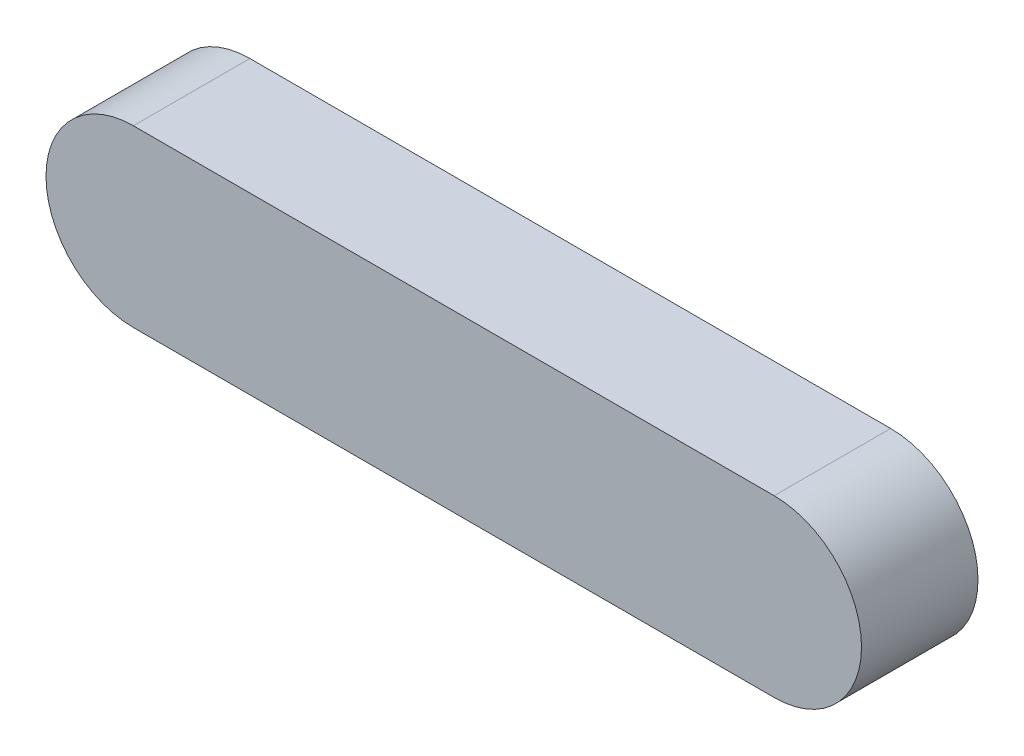
ISO-10303-21;
HEADER;
FILE_DESCRIPTION(('STEP AP214'),'2;1');
FILE_NAME('part.step','',(''),(''),'','','');
FILE_SCHEMA(('AUTOMOTIVE_DESIGN { 1 0 10303 214 1 1 1 1 }'));
ENDSEC;
DATA;
#1=APPLICATION_CONTEXT('core data for automotive mechanical design processes');
#2=APPLICATION_PROTOCOL_DEFINITION('international standard','automotive_design',2000,#1);
#3=PRODUCT_CONTEXT('',#1,'mechanical');
#4=PRODUCT('Part','Part','',(#3));
#5=PRODUCT_RELATED_PRODUCT_CATEGORY('part','',(#4));
#6=PRODUCT_DEFINITION_FORMATION('','',#4);
#7=PRODUCT_DEFINITION_CONTEXT('part definition',#1,'design');
#8=PRODUCT_DEFINITION('design','',#6,#7);
#9=PRODUCT_DEFINITION_SHAPE('','',#8);
#10=(LENGTH_UNIT() NAMED_UNIT(*) SI_UNIT(.MILLI.,.METRE.));
#11=(NAMED_UNIT(*) PLANE_ANGLE_UNIT() SI_UNIT($,.RADIAN.));
#12=(NAMED_UNIT(*) SI_UNIT($,.STERADIAN.) SOLID_ANGLE_UNIT());
#13=UNCERTAINTY_MEASURE_WITH_UNIT(LENGTH_MEASURE(1.E-05),#10,'distance_accuracy_value','');
#14=(GEOMETRIC_REPRESENTATION_CONTEXT(3) GLOBAL_UNCERTAINTY_ASSIGNED_CONTEXT((#13)) GLOBAL_UNIT_ASSIGNED_CONTEXT((#10,
#11,#12)) REPRESENTATION_CONTEXT('',''));
#15=CARTESIAN_POINT('',(0.,0.,0.));
#16=DIRECTION('',(0.,0.,1.));
#17=DIRECTION('',(1.,0.,0.));
#18=AXIS2_PLACEMENT_3D('',#15,#16,#17);
#19=CARTESIAN_POINT('',(-22.,0.,8.00000000000001));
#20=DIRECTION('',(0.,0.,-1.));
#21=DIRECTION('',(-1.,0.,0.));
#22=AXIS2_PLACEMENT_3D('',#19,#20,#21);
#23=CYLINDRICAL_SURFACE('',#22,6.);
#24=CARTESIAN_POINT('',(-22.,0.,0.));
#25=DIRECTION('',(0.,0.,1.));
#26=DIRECTION('',(1.,0.,0.));
#27=AXIS2_PLACEMENT_3D('',#24,#25,#26);
#28=CIRCLE('',#27,6.);
#29=CARTESIAN_POINT('',(-22.,6.00000000000001,0.));
#30=VERTEX_POINT('',#29);
#31=CARTESIAN_POINT('',(-22.,-6.00000000000001,0.));
#32=VERTEX_POINT('',#31);
#33=EDGE_CURVE('E95',#30,#32,#28,.T.);
#34=ORIENTED_EDGE('',*,*,#33,.T.);
#35=DIRECTION('',(0.,0.,-1.));
#36=VECTOR('',#35,1.);
#37=CARTESIAN_POINT('',(-22.,-6.00000000000001,8.00000000000001));
#38=LINE('',#37,#36);
#39=CARTESIAN_POINT('',(-22.,-6.00000000000001,8.00000000000001));
#40=VERTEX_POINT('',#39);
#41=EDGE_CURVE('E11',#40,#32,#38,.T.);
#42=ORIENTED_EDGE('',*,*,#41,.F.);
#43=CARTESIAN_POINT('',(-22.,0.,8.00000000000001));
#44=DIRECTION('',(0.,0.,1.));
#45=DIRECTION('',(1.,0.,0.));
#46=AXIS2_PLACEMENT_3D('',#43,#44,#45);
#47=CIRCLE('',#46,6.);
#48=CARTESIAN_POINT('',(-22.,6.00000000000001,8.00000000000001));
#49=VERTEX_POINT('',#48);
#50=EDGE_CURVE('E83',#49,#40,#47,.T.);
#51=ORIENTED_EDGE('',*,*,#50,.F.);
#52=DIRECTION('',(0.,0.,-1.));
#53=VECTOR('',#52,1.);
#54=CARTESIAN_POINT('',(-22.,6.00000000000001,8.00000000000001));
#55=LINE('',#54,#53);
#56=EDGE_CURVE('E91',#49,#30,#55,.T.);
#57=ORIENTED_EDGE('',*,*,#56,.T.);
#58=EDGE_LOOP('',(#34,#42,#51,#57));
#59=FACE_BOUND('',#58,.T.);
#60=ADVANCED_FACE('F32',(#59),#23,.T.);
#61=CARTESIAN_POINT('',(-22.,-6.00000000000001,8.00000000000001));
#62=DIRECTION('',(0.,1.,0.));
#63=DIRECTION('',(0.,0.,1.));
#64=AXIS2_PLACEMENT_3D('',#61,#62,#63);
#65=PLANE('',#64);
#66=DIRECTION('',(1.,0.,0.));
#67=VECTOR('',#66,1.);
#68=CARTESIAN_POINT('',(-22.,-6.00000000000001,0.));
#69=LINE('',#68,#67);
#70=CARTESIAN_POINT('',(22.,-6.00000000000001,0.));
#71=VERTEX_POINT('',#70);
#72=EDGE_CURVE('E87',#32,#71,#69,.T.);
#73=ORIENTED_EDGE('',*,*,#72,.T.);
#74=DIRECTION('',(0.,0.,-1.));
#75=VECTOR('',#74,1.);
#76=CARTESIAN_POINT('',(22.,-6.00000000000001,8.00000000000001));
#77=LINE('',#76,#75);
#78=CARTESIAN_POINT('',(22.,-6.00000000000001,8.00000000000001));
#79=VERTEX_POINT('',#78);
#80=EDGE_CURVE('E40',#79,#71,#77,.T.);
#81=ORIENTED_EDGE('',*,*,#80,.F.);
#82=DIRECTION('',(1.,0.,0.));
#83=VECTOR('',#82,1.);
#84=CARTESIAN_POINT('',(-22.,-6.00000000000001,8.00000000000001));
#85=LINE('',#84,#83);
#86=EDGE_CURVE('E78',#40,#79,#85,.T.);
#87=ORIENTED_EDGE('',*,*,#86,.F.);
#88=ORIENTED_EDGE('',*,*,#41,.T.);
#89=EDGE_LOOP('',(#73,#81,#87,#88));
#90=FACE_BOUND('',#89,.T.);
#91=ADVANCED_FACE('F86',(#90),#65,.F.);
#92=CARTESIAN_POINT('',(22.,0.,8.00000000000001));
#93=DIRECTION('',(0.,0.,-1.));
#94=DIRECTION('',(-1.,0.,0.));
#95=AXIS2_PLACEMENT_3D('',#92,#93,#94);
#96=CYLINDRICAL_SURFACE('',#95,6.);
#97=CARTESIAN_POINT('',(22.,0.,0.));
#98=DIRECTION('',(0.,0.,1.));
#99=DIRECTION('',(1.,0.,0.));
#100=AXIS2_PLACEMENT_3D('',#97,#98,#99);
#101=CIRCLE('',#100,6.);
#102=CARTESIAN_POINT('',(22.,6.00000000000001,0.));
#103=VERTEX_POINT('',#102);
#104=EDGE_CURVE('E65',#71,#103,#101,.T.);
#105=ORIENTED_EDGE('',*,*,#104,.T.);
#106=DIRECTION('',(0.,0.,-1.));
#107=VECTOR('',#106,1.);
#108=CARTESIAN_POINT('',(22.,6.00000000000001,8.00000000000001));
#109=LINE('',#108,#107);
#110=CARTESIAN_POINT('',(22.,6.00000000000001,8.00000000000001));
#111=VERTEX_POINT('',#110);
#112=EDGE_CURVE('E88',#111,#103,#109,.T.);
#113=ORIENTED_EDGE('',*,*,#112,.F.);
#114=CARTESIAN_POINT('',(22.,0.,8.00000000000001));
#115=DIRECTION('',(0.,0.,1.));
#116=DIRECTION('',(1.,0.,0.));
#117=AXIS2_PLACEMENT_3D('',#114,#115,#116);
#118=CIRCLE('',#117,6.);
#119=EDGE_CURVE('E81',#79,#111,#118,.T.);
#120=ORIENTED_EDGE('',*,*,#119,.F.);
#121=ORIENTED_EDGE('',*,*,#80,.T.);
#122=EDGE_LOOP('',(#105,#113,#120,#121));
#123=FACE_BOUND('',#122,.T.);
#124=ADVANCED_FACE('F89',(#123),#96,.T.);
#125=CARTESIAN_POINT('',(-22.,6.00000000000001,8.00000000000001));
#126=DIRECTION('',(0.,-1.,0.));
#127=DIRECTION('',(0.,0.,-1.));
#128=AXIS2_PLACEMENT_3D('',#125,#126,#127);
#129=PLANE('',#128);
#130=DIRECTION('',(-1.,0.,0.));
#131=VECTOR('',#130,1.);
#132=CARTESIAN_POINT('',(-22.,6.00000000000001,0.));
#133=LINE('',#132,#131);
#134=EDGE_CURVE('E71',#103,#30,#133,.T.);
#135=ORIENTED_EDGE('',*,*,#134,.T.);
#136=ORIENTED_EDGE('',*,*,#56,.F.);
#137=DIRECTION('',(-1.,0.,0.));
#138=VECTOR('',#137,1.);
#139=CARTESIAN_POINT('',(-22.,6.00000000000001,8.00000000000001));
#140=LINE('',#139,#138);
#141=EDGE_CURVE('E48',#111,#49,#140,.T.);
#142=ORIENTED_EDGE('',*,*,#141,.F.);
#143=ORIENTED_EDGE('',*,*,#112,.T.);
#144=EDGE_LOOP('',(#135,#136,#142,#143));
#145=FACE_BOUND('',#144,.T.);
#146=ADVANCED_FACE('F102',(#145),#129,.F.);
#147=CARTESIAN_POINT('',(-22.,0.,8.00000000000001));
#148=DIRECTION('',(0.,0.,1.));
#149=DIRECTION('',(1.,0.,0.));
#150=AXIS2_PLACEMENT_3D('',#147,#148,#149);
#151=PLANE('',#150);
#152=ORIENTED_EDGE('',*,*,#50,.T.);
#153=ORIENTED_EDGE('',*,*,#86,.T.);
#154=ORIENTED_EDGE('',*,*,#119,.T.);
#155=ORIENTED_EDGE('',*,*,#141,.T.);
#156=EDGE_LOOP('',(#152,#153,#154,#155));
#157=FACE_BOUND('',#156,.T.);
#158=ADVANCED_FACE('F79',(#157),#151,.T.);
#159=CARTESIAN_POINT('',(-22.,0.,0.));
#160=DIRECTION('',(0.,0.,1.));
#161=DIRECTION('',(1.,0.,0.));
#162=AXIS2_PLACEMENT_3D('',#159,#160,#161);
#163=PLANE('',#162);
#164=ORIENTED_EDGE('',*,*,#33,.F.);
#165=ORIENTED_EDGE('',*,*,#134,.F.);
#166=ORIENTED_EDGE('',*,*,#104,.F.);
#167=ORIENTED_EDGE('',*,*,#72,.F.);
#168=EDGE_LOOP('',(#164,#165,#166,#167));
#169=FACE_BOUND('',#168,.T.);
#170=ADVANCED_FACE('F105',(#169),#163,.F.);
#171=CLOSED_SHELL('',(#60,#91,#124,#146,#158,#170));
#172=MANIFOLD_SOLID_BREP('B2',#171);
#173=ADVANCED_BREP_SHAPE_REPRESENTATION('',(#18,#172),#14);
#174=SHAPE_DEFINITION_REPRESENTATION(#9,#173);
ENDSEC;
END-ISO-10303-21;
